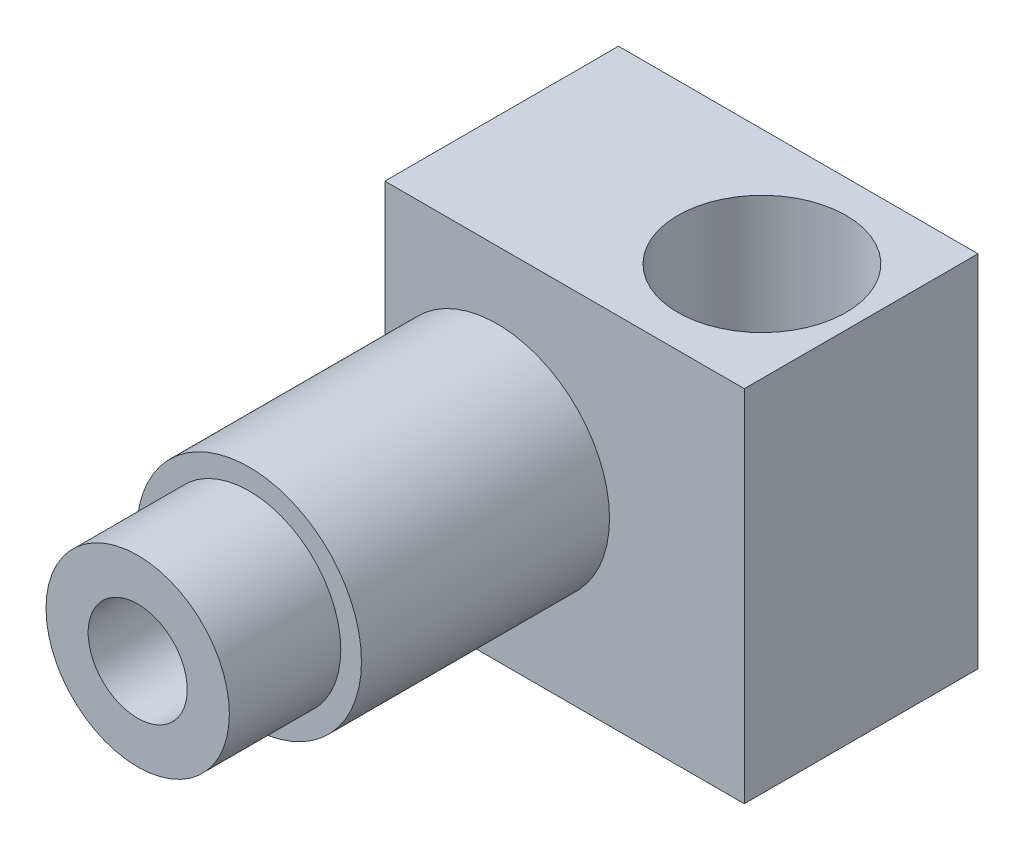
ISO-10303-21;
HEADER;
FILE_DESCRIPTION(('STEP AP214'),'2;1');
FILE_NAME('part.step','',(''),(''),'','','');
FILE_SCHEMA(('AUTOMOTIVE_DESIGN { 1 0 10303 214 1 1 1 1 }'));
ENDSEC;
DATA;
#1=APPLICATION_CONTEXT('core data for automotive mechanical design processes');
#2=APPLICATION_PROTOCOL_DEFINITION('international standard','automotive_design',2000,#1);
#3=PRODUCT_CONTEXT('',#1,'mechanical');
#4=PRODUCT('Part','Part','',(#3));
#5=PRODUCT_RELATED_PRODUCT_CATEGORY('part','',(#4));
#6=PRODUCT_DEFINITION_FORMATION('','',#4);
#7=PRODUCT_DEFINITION_CONTEXT('part definition',#1,'design');
#8=PRODUCT_DEFINITION('design','',#6,#7);
#9=PRODUCT_DEFINITION_SHAPE('','',#8);
#10=(LENGTH_UNIT() NAMED_UNIT(*) SI_UNIT(.MILLI.,.METRE.));
#11=(NAMED_UNIT(*) PLANE_ANGLE_UNIT() SI_UNIT($,.RADIAN.));
#12=(NAMED_UNIT(*) SI_UNIT($,.STERADIAN.) SOLID_ANGLE_UNIT());
#13=UNCERTAINTY_MEASURE_WITH_UNIT(LENGTH_MEASURE(1.E-05),#10,'distance_accuracy_value','');
#14=(GEOMETRIC_REPRESENTATION_CONTEXT(3) GLOBAL_UNCERTAINTY_ASSIGNED_CONTEXT((#13)) GLOBAL_UNIT_ASSIGNED_CONTEXT((#10,
#11,#12)) REPRESENTATION_CONTEXT('',''));
#15=CARTESIAN_POINT('',(0.,0.,0.));
#16=DIRECTION('',(0.,0.,1.));
#17=DIRECTION('',(1.,0.,0.));
#18=AXIS2_PLACEMENT_3D('',#15,#16,#17);
#19=CARTESIAN_POINT('',(-2.38125,0.,16.8275));
#20=DIRECTION('',(0.,0.,-1.));
#21=DIRECTION('',(-1.,0.,0.));
#22=AXIS2_PLACEMENT_3D('',#19,#20,#21);
#23=CYLINDRICAL_SURFACE('',#22,3.96875);
#24=CARTESIAN_POINT('',(-2.38125,0.,4.1275));
#25=DIRECTION('',(0.,0.,1.));
#26=DIRECTION('',(1.,0.,0.));
#27=AXIS2_PLACEMENT_3D('',#24,#25,#26);
#28=CIRCLE('',#27,3.96875);
#29=CARTESIAN_POINT('',(-6.35,0.,4.1275));
#30=VERTEX_POINT('',#29);
#31=EDGE_CURVE('E119',#30,#30,#28,.T.);
#32=ORIENTED_EDGE('',*,*,#31,.T.);
#33=EDGE_LOOP('',(#32));
#34=FACE_BOUND('',#33,.T.);
#35=CARTESIAN_POINT('',(-2.38125,0.,12.8905));
#36=DIRECTION('',(0.,0.,1.));
#37=DIRECTION('',(1.,0.,0.));
#38=AXIS2_PLACEMENT_3D('',#35,#36,#37);
#39=CIRCLE('',#38,3.96875);
#40=CARTESIAN_POINT('',(1.5875,0.,12.8905));
#41=VERTEX_POINT('',#40);
#42=EDGE_CURVE('E116',#41,#41,#39,.T.);
#43=ORIENTED_EDGE('',*,*,#42,.F.);
#44=EDGE_LOOP('',(#43));
#45=FACE_BOUND('',#44,.T.);
#46=ADVANCED_FACE('F34',(#34,#45),#23,.T.);
#47=CARTESIAN_POINT('',(0.,0.,4.1275));
#48=DIRECTION('',(0.,0.,-1.));
#49=DIRECTION('',(-1.,0.,0.));
#50=AXIS2_PLACEMENT_3D('',#47,#48,#49);
#51=PLANE('',#50);
#52=DIRECTION('',(0.,-1.,0.));
#53=VECTOR('',#52,1.);
#54=CARTESIAN_POINT('',(-6.35,-6.34999999999999,4.1275));
#55=LINE('',#54,#53);
#56=CARTESIAN_POINT('',(-6.35,6.35000000000001,4.1275));
#57=VERTEX_POINT('',#56);
#58=EDGE_CURVE('E185',#57,#30,#55,.T.);
#59=ORIENTED_EDGE('',*,*,#58,.T.);
#60=ORIENTED_EDGE('',*,*,#31,.F.);
#61=CARTESIAN_POINT('',(-6.35,-6.34999999999999,4.1275));
#62=VERTEX_POINT('',#61);
#63=EDGE_CURVE('E187',#30,#62,#55,.T.);
#64=ORIENTED_EDGE('',*,*,#63,.T.);
#65=DIRECTION('',(1.,0.,0.));
#66=VECTOR('',#65,1.);
#67=CARTESIAN_POINT('',(-6.35,-6.34999999999999,4.1275));
#68=LINE('',#67,#66);
#69=CARTESIAN_POINT('',(6.35,-6.34999999999999,4.1275));
#70=VERTEX_POINT('',#69);
#71=EDGE_CURVE('E52',#62,#70,#68,.T.);
#72=ORIENTED_EDGE('',*,*,#71,.T.);
#73=DIRECTION('',(0.,1.,0.));
#74=VECTOR('',#73,1.);
#75=CARTESIAN_POINT('',(6.35,-6.34999999999999,4.1275));
#76=LINE('',#75,#74);
#77=CARTESIAN_POINT('',(6.35,6.35000000000001,4.1275));
#78=VERTEX_POINT('',#77);
#79=EDGE_CURVE('E108',#70,#78,#76,.T.);
#80=ORIENTED_EDGE('',*,*,#79,.T.);
#81=DIRECTION('',(-1.,0.,0.));
#82=VECTOR('',#81,1.);
#83=CARTESIAN_POINT('',(-6.35,6.35000000000001,4.1275));
#84=LINE('',#83,#82);
#85=EDGE_CURVE('E84',#78,#57,#84,.T.);
#86=ORIENTED_EDGE('',*,*,#85,.T.);
#87=EDGE_LOOP('',(#59,#60,#64,#72,#80,#86));
#88=FACE_BOUND('',#87,.T.);
#89=ADVANCED_FACE('F141',(#88),#51,.F.);
#90=CARTESIAN_POINT('',(6.35,-6.34999999999999,4.1275));
#91=DIRECTION('',(-1.,0.,0.));
#92=DIRECTION('',(0.,0.,1.));
#93=AXIS2_PLACEMENT_3D('',#90,#91,#92);
#94=PLANE('',#93);
#95=DIRECTION('',(0.,1.,0.));
#96=VECTOR('',#95,1.);
#97=CARTESIAN_POINT('',(6.35,-6.34999999999999,-4.1275));
#98=LINE('',#97,#96);
#99=CARTESIAN_POINT('',(6.35,-6.34999999999999,-4.1275));
#100=VERTEX_POINT('',#99);
#101=CARTESIAN_POINT('',(6.35,6.35000000000001,-4.1275));
#102=VERTEX_POINT('',#101);
#103=EDGE_CURVE('E103',#100,#102,#98,.T.);
#104=ORIENTED_EDGE('',*,*,#103,.T.);
#105=DIRECTION('',(0.,0.,-1.));
#106=VECTOR('',#105,1.);
#107=CARTESIAN_POINT('',(6.35,6.35000000000001,4.1275));
#108=LINE('',#107,#106);
#109=EDGE_CURVE('E114',#78,#102,#108,.T.);
#110=ORIENTED_EDGE('',*,*,#109,.F.);
#111=ORIENTED_EDGE('',*,*,#79,.F.);
#112=DIRECTION('',(0.,0.,-1.));
#113=VECTOR('',#112,1.);
#114=CARTESIAN_POINT('',(6.35,-6.34999999999999,4.1275));
#115=LINE('',#114,#113);
#116=EDGE_CURVE('E109',#70,#100,#115,.T.);
#117=ORIENTED_EDGE('',*,*,#116,.T.);
#118=EDGE_LOOP('',(#104,#110,#111,#117));
#119=FACE_BOUND('',#118,.T.);
#120=ADVANCED_FACE('F147',(#119),#94,.F.);
#121=CARTESIAN_POINT('',(-6.35,6.35000000000001,4.1275));
#122=DIRECTION('',(0.,-1.,0.));
#123=DIRECTION('',(0.,0.,-1.));
#124=AXIS2_PLACEMENT_3D('',#121,#122,#123);
#125=PLANE('',#124);
#126=CARTESIAN_POINT('',(2.8448,6.35000000000001,0.));
#127=DIRECTION('',(0.,-1.,0.));
#128=DIRECTION('',(0.,0.,-1.));
#129=AXIS2_PLACEMENT_3D('',#126,#127,#128);
#130=CIRCLE('',#129,2.9718);
#131=CARTESIAN_POINT('',(2.8448,6.35000000000001,-2.9718));
#132=VERTEX_POINT('',#131);
#133=EDGE_CURVE('E179',#132,#132,#130,.T.);
#134=ORIENTED_EDGE('',*,*,#133,.T.);
#135=EDGE_LOOP('',(#134));
#136=FACE_BOUND('',#135,.T.);
#137=DIRECTION('',(-1.,0.,0.));
#138=VECTOR('',#137,1.);
#139=CARTESIAN_POINT('',(-6.35,6.35000000000001,-4.1275));
#140=LINE('',#139,#138);
#141=CARTESIAN_POINT('',(-6.35,6.35000000000001,-4.1275));
#142=VERTEX_POINT('',#141);
#143=EDGE_CURVE('E102',#102,#142,#140,.T.);
#144=ORIENTED_EDGE('',*,*,#143,.T.);
#145=DIRECTION('',(0.,0.,-1.));
#146=VECTOR('',#145,1.);
#147=CARTESIAN_POINT('',(-6.35,6.35000000000001,4.1275));
#148=LINE('',#147,#146);
#149=EDGE_CURVE('E94',#57,#142,#148,.T.);
#150=ORIENTED_EDGE('',*,*,#149,.F.);
#151=ORIENTED_EDGE('',*,*,#85,.F.);
#152=ORIENTED_EDGE('',*,*,#109,.T.);
#153=EDGE_LOOP('',(#144,#150,#151,#152));
#154=FACE_BOUND('',#153,.T.);
#155=ADVANCED_FACE('F168',(#136,#154),#125,.F.);
#156=CARTESIAN_POINT('',(-6.35,-6.34999999999999,4.1275));
#157=DIRECTION('',(1.,0.,0.));
#158=DIRECTION('',(0.,0.,-1.));
#159=AXIS2_PLACEMENT_3D('',#156,#157,#158);
#160=PLANE('',#159);
#161=CARTESIAN_POINT('',(-6.35,4.35000000000001,-0.8725));
#162=DIRECTION('',(-1.,0.,0.));
#163=DIRECTION('',(0.,0.,1.));
#164=AXIS2_PLACEMENT_3D('',#161,#162,#163);
#165=CIRCLE('',#164,1.143);
#166=CARTESIAN_POINT('',(-6.35,4.35000000000001,0.2705));
#167=VERTEX_POINT('',#166);
#168=EDGE_CURVE('E209',#167,#167,#165,.T.);
#169=ORIENTED_EDGE('',*,*,#168,.F.);
#170=EDGE_LOOP('',(#169));
#171=FACE_BOUND('',#170,.T.);
#172=DIRECTION('',(0.,-1.,0.));
#173=VECTOR('',#172,1.);
#174=CARTESIAN_POINT('',(-6.35,-6.34999999999999,-4.1275));
#175=LINE('',#174,#173);
#176=CARTESIAN_POINT('',(-6.35,0.,-4.1275));
#177=VERTEX_POINT('',#176);
#178=EDGE_CURVE('E91',#142,#177,#175,.T.);
#179=ORIENTED_EDGE('',*,*,#178,.T.);
#180=CARTESIAN_POINT('',(-6.35,-6.34999999999999,-4.1275));
#181=VERTEX_POINT('',#180);
#182=EDGE_CURVE('E70',#177,#181,#175,.T.);
#183=ORIENTED_EDGE('',*,*,#182,.T.);
#184=DIRECTION('',(0.,0.,-1.));
#185=VECTOR('',#184,1.);
#186=CARTESIAN_POINT('',(-6.35,-6.34999999999999,4.1275));
#187=LINE('',#186,#185);
#188=EDGE_CURVE('E111',#62,#181,#187,.T.);
#189=ORIENTED_EDGE('',*,*,#188,.F.);
#190=ORIENTED_EDGE('',*,*,#63,.F.);
#191=ORIENTED_EDGE('',*,*,#58,.F.);
#192=ORIENTED_EDGE('',*,*,#149,.T.);
#193=EDGE_LOOP('',(#179,#183,#189,#190,#191,#192));
#194=FACE_BOUND('',#193,.T.);
#195=ADVANCED_FACE('F92',(#171,#194),#160,.F.);
#196=CARTESIAN_POINT('',(-6.35,-6.34999999999999,4.1275));
#197=DIRECTION('',(0.,1.,0.));
#198=DIRECTION('',(0.,0.,1.));
#199=AXIS2_PLACEMENT_3D('',#196,#197,#198);
#200=PLANE('',#199);
#201=CARTESIAN_POINT('',(2.8448,-6.34999999999999,0.));
#202=DIRECTION('',(0.,-1.,0.));
#203=DIRECTION('',(0.,0.,-1.));
#204=AXIS2_PLACEMENT_3D('',#201,#202,#203);
#205=CIRCLE('',#204,2.9718);
#206=CARTESIAN_POINT('',(2.8448,-6.34999999999999,-2.9718));
#207=VERTEX_POINT('',#206);
#208=EDGE_CURVE('E181',#207,#207,#205,.T.);
#209=ORIENTED_EDGE('',*,*,#208,.F.);
#210=EDGE_LOOP('',(#209));
#211=FACE_BOUND('',#210,.T.);
#212=DIRECTION('',(1.,0.,0.));
#213=VECTOR('',#212,1.);
#214=CARTESIAN_POINT('',(-6.35,-6.34999999999999,-4.1275));
#215=LINE('',#214,#213);
#216=EDGE_CURVE('E76',#181,#100,#215,.T.);
#217=ORIENTED_EDGE('',*,*,#216,.T.);
#218=ORIENTED_EDGE('',*,*,#116,.F.);
#219=ORIENTED_EDGE('',*,*,#71,.F.);
#220=ORIENTED_EDGE('',*,*,#188,.T.);
#221=EDGE_LOOP('',(#217,#218,#219,#220));
#222=FACE_BOUND('',#221,.T.);
#223=ADVANCED_FACE('F162',(#211,#222),#200,.F.);
#224=CARTESIAN_POINT('',(0.,0.,-4.1275));
#225=DIRECTION('',(0.,0.,-1.));
#226=DIRECTION('',(-1.,0.,0.));
#227=AXIS2_PLACEMENT_3D('',#224,#225,#226);
#228=PLANE('',#227);
#229=ORIENTED_EDGE('',*,*,#182,.F.);
#230=CARTESIAN_POINT('',(-2.38125,0.,-4.1275));
#231=DIRECTION('',(0.,0.,-1.));
#232=DIRECTION('',(-1.,0.,0.));
#233=AXIS2_PLACEMENT_3D('',#230,#231,#232);
#234=CIRCLE('',#233,3.96875);
#235=EDGE_CURVE('E100',#177,#177,#234,.T.);
#236=ORIENTED_EDGE('',*,*,#235,.F.);
#237=ORIENTED_EDGE('',*,*,#178,.F.);
#238=ORIENTED_EDGE('',*,*,#143,.F.);
#239=ORIENTED_EDGE('',*,*,#103,.F.);
#240=ORIENTED_EDGE('',*,*,#216,.F.);
#241=EDGE_LOOP('',(#229,#236,#237,#238,#239,#240));
#242=FACE_BOUND('',#241,.T.);
#243=ADVANCED_FACE('F98',(#242),#228,.T.);
#244=CARTESIAN_POINT('',(2.8448,6.35000000000001,0.));
#245=DIRECTION('',(0.,-1.,0.));
#246=DIRECTION('',(0.,0.,-1.));
#247=AXIS2_PLACEMENT_3D('',#244,#245,#246);
#248=CYLINDRICAL_SURFACE('',#247,2.9718);
#249=ORIENTED_EDGE('',*,*,#133,.F.);
#250=EDGE_LOOP('',(#249));
#251=FACE_BOUND('',#250,.T.);
#252=ORIENTED_EDGE('',*,*,#208,.T.);
#253=EDGE_LOOP('',(#252));
#254=FACE_BOUND('',#253,.T.);
#255=ADVANCED_FACE('F155',(#251,#254),#248,.F.);
#256=CARTESIAN_POINT('',(0.,0.,12.8905));
#257=DIRECTION('',(0.,0.,1.));
#258=DIRECTION('',(1.,0.,0.));
#259=AXIS2_PLACEMENT_3D('',#256,#257,#258);
#260=PLANE('',#259);
#261=CARTESIAN_POINT('',(-2.38125,0.,12.8905));
#262=DIRECTION('',(0.,0.,1.));
#263=DIRECTION('',(1.,0.,0.));
#264=AXIS2_PLACEMENT_3D('',#261,#262,#263);
#265=CIRCLE('',#264,3.2385);
#266=CARTESIAN_POINT('',(0.857250000000002,0.,12.8905));
#267=VERTEX_POINT('',#266);
#268=EDGE_CURVE('E120',#267,#267,#265,.T.);
#269=ORIENTED_EDGE('',*,*,#268,.F.);
#270=EDGE_LOOP('',(#269));
#271=FACE_BOUND('',#270,.T.);
#272=ORIENTED_EDGE('',*,*,#42,.T.);
#273=EDGE_LOOP('',(#272));
#274=FACE_BOUND('',#273,.T.);
#275=ADVANCED_FACE('F157',(#271,#274),#260,.T.);
#276=CARTESIAN_POINT('',(-2.38125,0.,12.8905));
#277=DIRECTION('',(0.,0.,1.));
#278=DIRECTION('',(1.,0.,0.));
#279=AXIS2_PLACEMENT_3D('',#276,#277,#278);
#280=CYLINDRICAL_SURFACE('',#279,3.2385);
#281=ORIENTED_EDGE('',*,*,#268,.T.);
#282=EDGE_LOOP('',(#281));
#283=FACE_BOUND('',#282,.T.);
#284=CARTESIAN_POINT('',(-2.38125,0.,16.8275));
#285=DIRECTION('',(0.,0.,1.));
#286=DIRECTION('',(1.,0.,0.));
#287=AXIS2_PLACEMENT_3D('',#284,#285,#286);
#288=CIRCLE('',#287,3.2385);
#289=CARTESIAN_POINT('',(0.857250000000002,0.,16.8275));
#290=VERTEX_POINT('',#289);
#291=EDGE_CURVE('E193',#290,#290,#288,.T.);
#292=ORIENTED_EDGE('',*,*,#291,.F.);
#293=EDGE_LOOP('',(#292));
#294=FACE_BOUND('',#293,.T.);
#295=ADVANCED_FACE('F237',(#283,#294),#280,.T.);
#296=CARTESIAN_POINT('',(-2.38125,0.,16.8275));
#297=DIRECTION('',(0.,0.,1.));
#298=DIRECTION('',(1.,0.,0.));
#299=AXIS2_PLACEMENT_3D('',#296,#297,#298);
#300=PLANE('',#299);
#301=CARTESIAN_POINT('',(-2.38125,0.,16.8275));
#302=DIRECTION('',(0.,0.,1.));
#303=DIRECTION('',(1.,0.,0.));
#304=AXIS2_PLACEMENT_3D('',#301,#302,#303);
#305=CIRCLE('',#304,1.75);
#306=CARTESIAN_POINT('',(-0.631249999999998,0.,16.8275));
#307=VERTEX_POINT('',#306);
#308=EDGE_CURVE('E205',#307,#307,#305,.T.);
#309=ORIENTED_EDGE('',*,*,#308,.F.);
#310=EDGE_LOOP('',(#309));
#311=FACE_BOUND('',#310,.T.);
#312=ORIENTED_EDGE('',*,*,#291,.T.);
#313=EDGE_LOOP('',(#312));
#314=FACE_BOUND('',#313,.T.);
#315=ADVANCED_FACE('F153',(#311,#314),#300,.T.);
#316=CARTESIAN_POINT('',(-2.38125,0.,-7.1755));
#317=DIRECTION('',(0.,0.,1.));
#318=DIRECTION('',(1.,0.,0.));
#319=AXIS2_PLACEMENT_3D('',#316,#317,#318);
#320=CYLINDRICAL_SURFACE('',#319,3.96875);
#321=CARTESIAN_POINT('',(-2.38125,0.,-5.4255));
#322=DIRECTION('',(0.,0.,-1.));
#323=DIRECTION('',(-1.,0.,0.));
#324=AXIS2_PLACEMENT_3D('',#321,#322,#323);
#325=CIRCLE('',#324,3.96875);
#326=CARTESIAN_POINT('',(1.5875,0.,-5.4255));
#327=VERTEX_POINT('',#326);
#328=EDGE_CURVE('E12',#327,#327,#325,.F.);
#329=ORIENTED_EDGE('',*,*,#328,.T.);
#330=EDGE_LOOP('',(#329));
#331=FACE_BOUND('',#330,.T.);
#332=ORIENTED_EDGE('',*,*,#235,.T.);
#333=EDGE_LOOP('',(#332));
#334=FACE_BOUND('',#333,.T.);
#335=ADVANCED_FACE('F136',(#331,#334),#320,.T.);
#336=CARTESIAN_POINT('',(-2.38125,0.,-7.1755));
#337=DIRECTION('',(0.,0.,-1.));
#338=DIRECTION('',(-1.,0.,0.));
#339=AXIS2_PLACEMENT_3D('',#336,#337,#338);
#340=PLANE('',#339);
#341=CARTESIAN_POINT('',(-2.38125,0.,-7.1755));
#342=DIRECTION('',(0.,0.,-1.));
#343=DIRECTION('',(-1.,0.,0.));
#344=AXIS2_PLACEMENT_3D('',#341,#342,#343);
#345=CIRCLE('',#344,0.175);
#346=CARTESIAN_POINT('',(-2.55625,0.,-7.1755));
#347=VERTEX_POINT('',#346);
#348=EDGE_CURVE('E199',#347,#347,#345,.T.);
#349=ORIENTED_EDGE('',*,*,#348,.F.);
#350=EDGE_LOOP('',(#349));
#351=FACE_BOUND('',#350,.T.);
#352=CARTESIAN_POINT('',(-2.38125,0.,-7.1755));
#353=DIRECTION('',(0.,0.,-1.));
#354=DIRECTION('',(-1.,0.,0.));
#355=AXIS2_PLACEMENT_3D('',#352,#353,#354);
#356=CIRCLE('',#355,0.937661086754477);
#357=CARTESIAN_POINT('',(-1.44358891324552,0.,-7.1755));
#358=VERTEX_POINT('',#357);
#359=EDGE_CURVE('E44',#358,#358,#356,.T.);
#360=ORIENTED_EDGE('',*,*,#359,.T.);
#361=EDGE_LOOP('',(#360));
#362=FACE_BOUND('',#361,.T.);
#363=ADVANCED_FACE('F124',(#351,#362),#340,.T.);
#364=CARTESIAN_POINT('',(-2.38125,0.,-7.1755));
#365=DIRECTION('',(0.,0.,1.));
#366=DIRECTION('',(1.,0.,0.));
#367=AXIS2_PLACEMENT_3D('',#364,#365,#366);
#368=CONICAL_SURFACE('',#367,0.937661086754477,1.0471975511966);
#369=CARTESIAN_POINT('',(1.5875,0.,-5.4255));
#370=CARTESIAN_POINT('',(1.5559261571537,0.,-5.44372916666667));
#371=CARTESIAN_POINT('',(1.52435231430739,0.,-5.46195833333333));
#372=CARTESIAN_POINT('',(1.46120462861477,0.,-5.49841666666667));
#373=CARTESIAN_POINT('',(1.42963078576847,0.,-5.51664583333333));
#374=CARTESIAN_POINT('',(1.36648310007585,0.,-5.55310416666667));
#375=CARTESIAN_POINT('',(1.33490925722954,0.,-5.57133333333333));
#376=CARTESIAN_POINT('',(1.27176157153693,0.,-5.60779166666667));
#377=CARTESIAN_POINT('',(1.24018772869062,0.,-5.62602083333333));
#378=CARTESIAN_POINT('',(1.17704004299801,0.,-5.66247916666667));
#379=CARTESIAN_POINT('',(1.1454662001517,0.,-5.68070833333333));
#380=CARTESIAN_POINT('',(1.08231851445908,0.,-5.71716666666667));
#381=CARTESIAN_POINT('',(1.05074467161278,0.,-5.73539583333333));
#382=CARTESIAN_POINT('',(0.987596985920161,0.,-5.77185416666667));
#383=CARTESIAN_POINT('',(0.956023143073853,0.,-5.79008333333333));
#384=CARTESIAN_POINT('',(0.892875457381238,0.,-5.82654166666667));
#385=CARTESIAN_POINT('',(0.86130161453493,0.,-5.84477083333333));
#386=CARTESIAN_POINT('',(0.798153928842315,0.,-5.88122916666667));
#387=CARTESIAN_POINT('',(0.766580085996008,0.,-5.89945833333333));
#388=CARTESIAN_POINT('',(0.703432400303393,0.,-5.93591666666667));
#389=CARTESIAN_POINT('',(0.671858557457085,0.,-5.95414583333333));
#390=CARTESIAN_POINT('',(0.60871087176447,0.,-5.99060416666667));
#391=CARTESIAN_POINT('',(0.577137028918162,0.,-6.00883333333333));
#392=CARTESIAN_POINT('',(0.513989343225547,0.,-6.04529166666667));
#393=CARTESIAN_POINT('',(0.48241550037924,0.,-6.06352083333333));
#394=CARTESIAN_POINT('',(0.419267814686625,0.,-6.09997916666667));
#395=CARTESIAN_POINT('',(0.387693971840317,0.,-6.11820833333333));
#396=CARTESIAN_POINT('',(0.324546286147702,0.,-6.15466666666667));
#397=CARTESIAN_POINT('',(0.292972443301395,0.,-6.17289583333333));
#398=CARTESIAN_POINT('',(0.22982475760878,0.,-6.20935416666667));
#399=CARTESIAN_POINT('',(0.198250914762472,0.,-6.22758333333333));
#400=CARTESIAN_POINT('',(0.135103229069857,0.,-6.26404166666666));
#401=CARTESIAN_POINT('',(0.103529386223549,0.,-6.28227083333333));
#402=CARTESIAN_POINT('',(0.0403817005309344,0.,-6.31872916666667));
#403=CARTESIAN_POINT('',(0.00880785768462691,0.,-6.33695833333333));
#404=CARTESIAN_POINT('',(-0.0543398280079883,0.,-6.37341666666667));
#405=CARTESIAN_POINT('',(-0.085913670854296,0.,-6.39164583333333));
#406=CARTESIAN_POINT('',(-0.149061356546911,0.,-6.42810416666667));
#407=CARTESIAN_POINT('',(-0.180635199393218,0.,-6.44633333333333));
#408=CARTESIAN_POINT('',(-0.243782885085833,0.,-6.48279166666667));
#409=CARTESIAN_POINT('',(-0.275356727932141,0.,-6.50102083333333));
#410=CARTESIAN_POINT('',(-0.338504413624756,0.,-6.53747916666667));
#411=CARTESIAN_POINT('',(-0.370078256471064,0.,-6.55570833333333));
#412=CARTESIAN_POINT('',(-0.433225942163679,0.,-6.59216666666667));
#413=CARTESIAN_POINT('',(-0.464799785009986,0.,-6.61039583333333));
#414=CARTESIAN_POINT('',(-0.527947470702601,0.,-6.64685416666667));
#415=CARTESIAN_POINT('',(-0.559521313548909,0.,-6.66508333333333));
#416=CARTESIAN_POINT('',(-0.622668999241524,0.,-6.70154166666667));
#417=CARTESIAN_POINT('',(-0.654242842087832,0.,-6.71977083333333));
#418=CARTESIAN_POINT('',(-0.717390527780447,0.,-6.75622916666667));
#419=CARTESIAN_POINT('',(-0.748964370626754,0.,-6.77445833333333));
#420=CARTESIAN_POINT('',(-0.812112056319369,0.,-6.81091666666667));
#421=CARTESIAN_POINT('',(-0.843685899165677,0.,-6.82914583333333));
#422=CARTESIAN_POINT('',(-0.906833584858292,0.,-6.86560416666667));
#423=CARTESIAN_POINT('',(-0.938407427704599,0.,-6.88383333333333));
#424=CARTESIAN_POINT('',(-1.00155511339721,0.,-6.92029166666667));
#425=CARTESIAN_POINT('',(-1.03312895624352,0.,-6.93852083333333));
#426=CARTESIAN_POINT('',(-1.09627664193614,0.,-6.97497916666667));
#427=CARTESIAN_POINT('',(-1.12785048478244,0.,-6.99320833333333));
#428=CARTESIAN_POINT('',(-1.19099817047506,0.,-7.02966666666667));
#429=CARTESIAN_POINT('',(-1.22257201332137,0.,-7.04789583333333));
#430=CARTESIAN_POINT('',(-1.28571969901398,0.,-7.08435416666667));
#431=CARTESIAN_POINT('',(-1.31729354186029,0.,-7.10258333333333));
#432=CARTESIAN_POINT('',(-1.3804412275529,0.,-7.13904166666667));
#433=CARTESIAN_POINT('',(-1.41201507039921,0.,-7.15727083333333));
#434=CARTESIAN_POINT('',(-1.44358891324552,0.,-7.1755));
#435=B_SPLINE_CURVE_WITH_KNOTS('',3,(#369,#370,#371,#372,#373,#374,#375,#376,#377,#378,#379,
#380,#381,#382,#383,#384,#385,#386,#387,#388,#389,#390,#391,#392,#393,#394,#395,#396,#397,#398,
#399,#400,#401,#402,#403,#404,#405,#406,#407,#408,#409,#410,#411,#412,#413,#414,#415,#416,#417,
#418,#419,#420,#421,#422,#423,#424,#425,#426,#427,#428,#429,#430,#431,#432,#433,#434),
.UNSPECIFIED.,.F.,.F.,(4,2,2,2,2,2,2,2,2,2,2,2,2,2,2,2,2,2,2,2,2,2,2,2,2,2,2,2,2,2,2,2,4),(0.,
0.109375,0.21875,0.328124999999999,0.437499999999999,0.546874999999999,0.656249999999998,
0.765624999999998,0.874999999999998,0.984374999999997,1.09375,1.203125,1.3125,1.421875,1.53125,
1.640625,1.75,1.85937499999999,1.96874999999999,2.07812499999999,2.18749999999999,
2.29687499999999,2.40624999999999,2.51562499999999,2.62499999999999,2.73437499999999,
2.84374999999999,2.95312499999999,3.06249999999999,3.17187499999999,3.28124999999999,
3.39062499999999,3.49999999999999),.UNSPECIFIED.);
#436=EDGE_CURVE('BSEAM36',#327,#358,#435,.T.);
#437=ORIENTED_EDGE('',*,*,#328,.F.);
#438=ORIENTED_EDGE('',*,*,#359,.F.);
#439=ORIENTED_EDGE('',*,*,#436,.T.);
#440=ORIENTED_EDGE('',*,*,#436,.F.);
#441=EDGE_LOOP('',(#437,#439,#438,#440));
#442=FACE_BOUND('',#441,.T.);
#443=ADVANCED_FACE('F36',(#442),#368,.T.);
#444=CARTESIAN_POINT('',(-2.38125,0.,16.8275));
#445=DIRECTION('',(0.,0.,-1.));
#446=DIRECTION('',(-1.,0.,0.));
#447=AXIS2_PLACEMENT_3D('',#444,#445,#446);
#448=CYLINDRICAL_SURFACE('',#447,0.175);
#449=CARTESIAN_POINT('',(-2.38125,0.,-5.11885547496842));
#450=DIRECTION('',(0.,0.,1.));
#451=DIRECTION('',(1.,0.,0.));
#452=AXIS2_PLACEMENT_3D('',#449,#450,#451);
#453=CIRCLE('',#452,0.175);
#454=CARTESIAN_POINT('',(-2.20625,0.,-5.11885547496842));
#455=VERTEX_POINT('',#454);
#456=EDGE_CURVE('E38',#455,#455,#453,.T.);
#457=ORIENTED_EDGE('',*,*,#456,.T.);
#458=EDGE_LOOP('',(#457));
#459=FACE_BOUND('',#458,.T.);
#460=ORIENTED_EDGE('',*,*,#348,.T.);
#461=EDGE_LOOP('',(#460));
#462=FACE_BOUND('',#461,.T.);
#463=ADVANCED_FACE('F127',(#459,#462),#448,.F.);
#464=CARTESIAN_POINT('',(-2.38125,0.,-4.1725));
#465=DIRECTION('',(0.,0.,1.));
#466=DIRECTION('',(1.,0.,0.));
#467=AXIS2_PLACEMENT_3D('',#464,#465,#466);
#468=CONICAL_SURFACE('',#467,1.75,1.02974425867665);
#469=CARTESIAN_POINT('',(-2.38125,0.,-4.1725));
#470=DIRECTION('',(0.,0.,1.));
#471=DIRECTION('',(1.,0.,0.));
#472=AXIS2_PLACEMENT_3D('',#469,#470,#471);
#473=CIRCLE('',#472,1.75);
#474=CARTESIAN_POINT('',(-0.631250000000002,0.,-4.1725));
#475=VERTEX_POINT('',#474);
#476=EDGE_CURVE('E202',#475,#475,#473,.T.);
#477=CARTESIAN_POINT('',(-0.631250000000002,0.,-4.1725));
#478=CARTESIAN_POINT('',(-0.647656250000002,0.,-4.18235786953092));
#479=CARTESIAN_POINT('',(-0.664062500000002,0.,-4.19221573906185));
#480=CARTESIAN_POINT('',(-0.696875000000002,0.,-4.21193147812369));
#481=CARTESIAN_POINT('',(-0.713281250000002,0.,-4.22178934765461));
#482=CARTESIAN_POINT('',(-0.746093750000002,0.,-4.24150508671645));
#483=CARTESIAN_POINT('',(-0.762500000000002,0.,-4.25136295624737));
#484=CARTESIAN_POINT('',(-0.795312500000001,0.,-4.27107869530921));
#485=CARTESIAN_POINT('',(-0.811718750000001,0.,-4.28093656484013));
#486=CARTESIAN_POINT('',(-0.844531250000001,0.,-4.30065230390198));
#487=CARTESIAN_POINT('',(-0.860937500000001,0.,-4.3105101734329));
#488=CARTESIAN_POINT('',(-0.893750000000001,0.,-4.33022591249474));
#489=CARTESIAN_POINT('',(-0.910156250000001,0.,-4.34008378202566));
#490=CARTESIAN_POINT('',(-0.942968750000001,0.,-4.3597995210875));
#491=CARTESIAN_POINT('',(-0.959375000000001,0.,-4.36965739061842));
#492=CARTESIAN_POINT('',(-0.992187500000001,0.,-4.38937312968026));
#493=CARTESIAN_POINT('',(-1.00859375,0.,-4.39923099921119));
#494=CARTESIAN_POINT('',(-1.04140625,0.,-4.41894673827303));
#495=CARTESIAN_POINT('',(-1.0578125,0.,-4.42880460780395));
#496=CARTESIAN_POINT('',(-1.090625,0.,-4.44852034686579));
#497=CARTESIAN_POINT('',(-1.10703125,0.,-4.45837821639671));
#498=CARTESIAN_POINT('',(-1.13984375,0.,-4.47809395545855));
#499=CARTESIAN_POINT('',(-1.15625,0.,-4.48795182498947));
#500=CARTESIAN_POINT('',(-1.1890625,0.,-4.50766756405132));
#501=CARTESIAN_POINT('',(-1.20546875,0.,-4.51752543358224));
#502=CARTESIAN_POINT('',(-1.23828125,0.,-4.53724117264408));
#503=CARTESIAN_POINT('',(-1.2546875,0.,-4.547099042175));
#504=CARTESIAN_POINT('',(-1.2875,0.,-4.56681478123684));
#505=CARTESIAN_POINT('',(-1.30390625,0.,-4.57667265076776));
#506=CARTESIAN_POINT('',(-1.33671875,0.,-4.5963883898296));
#507=CARTESIAN_POINT('',(-1.353125,0.,-4.60624625936052));
#508=CARTESIAN_POINT('',(-1.3859375,0.,-4.62596199842237));
#509=CARTESIAN_POINT('',(-1.40234375,0.,-4.63581986795329));
#510=CARTESIAN_POINT('',(-1.43515625,0.,-4.65553560701513));
#511=CARTESIAN_POINT('',(-1.4515625,0.,-4.66539347654605));
#512=CARTESIAN_POINT('',(-1.484375,0.,-4.68510921560789));
#513=CARTESIAN_POINT('',(-1.50078125,0.,-4.69496708513882));
#514=CARTESIAN_POINT('',(-1.53359375,0.,-4.71468282420066));
#515=CARTESIAN_POINT('',(-1.55,0.,-4.72454069373158));
#516=CARTESIAN_POINT('',(-1.5828125,0.,-4.74425643279342));
#517=CARTESIAN_POINT('',(-1.59921875,0.,-4.75411430232434));
#518=CARTESIAN_POINT('',(-1.63203125,0.,-4.77383004138618));
#519=CARTESIAN_POINT('',(-1.6484375,0.,-4.7836879109171));
#520=CARTESIAN_POINT('',(-1.68125,0.,-4.80340364997894));
#521=CARTESIAN_POINT('',(-1.69765625,0.,-4.81326151950987));
#522=CARTESIAN_POINT('',(-1.73046875,0.,-4.83297725857171));
#523=CARTESIAN_POINT('',(-1.746875,0.,-4.84283512810263));
#524=CARTESIAN_POINT('',(-1.7796875,0.,-4.86255086716447));
#525=CARTESIAN_POINT('',(-1.79609375,0.,-4.87240873669539));
#526=CARTESIAN_POINT('',(-1.82890625,0.,-4.89212447575723));
#527=CARTESIAN_POINT('',(-1.8453125,0.,-4.90198234528815));
#528=CARTESIAN_POINT('',(-1.878125,0.,-4.92169808435));
#529=CARTESIAN_POINT('',(-1.89453125,0.,-4.93155595388092));
#530=CARTESIAN_POINT('',(-1.92734375,0.,-4.95127169294276));
#531=CARTESIAN_POINT('',(-1.94375,0.,-4.96112956247368));
#532=CARTESIAN_POINT('',(-1.9765625,0.,-4.98084530153552));
#533=CARTESIAN_POINT('',(-1.99296875,0.,-4.99070317106644));
#534=CARTESIAN_POINT('',(-2.02578125,0.,-5.01041891012829));
#535=CARTESIAN_POINT('',(-2.0421875,0.,-5.02027677965921));
#536=CARTESIAN_POINT('',(-2.075,0.,-5.03999251872105));
#537=CARTESIAN_POINT('',(-2.09140625,0.,-5.04985038825197));
#538=CARTESIAN_POINT('',(-2.12421875,0.,-5.06956612731381));
#539=CARTESIAN_POINT('',(-2.140625,0.,-5.07942399684473));
#540=CARTESIAN_POINT('',(-2.1734375,0.,-5.09913973590657));
#541=CARTESIAN_POINT('',(-2.18984375,0.,-5.1089976054375));
#542=CARTESIAN_POINT('',(-2.20625,0.,-5.11885547496842));
#543=B_SPLINE_CURVE_WITH_KNOTS('',3,(#477,#478,#479,#480,#481,#482,#483,#484,#485,#486,#487,
#488,#489,#490,#491,#492,#493,#494,#495,#496,#497,#498,#499,#500,#501,#502,#503,#504,#505,#506,
#507,#508,#509,#510,#511,#512,#513,#514,#515,#516,#517,#518,#519,#520,#521,#522,#523,#524,#525,
#526,#527,#528,#529,#530,#531,#532,#533,#534,#535,#536,#537,#538,#539,#540,#541,#542),
.UNSPECIFIED.,.F.,.F.,(4,2,2,2,2,2,2,2,2,2,2,2,2,2,2,2,2,2,2,2,2,2,2,2,2,2,2,2,2,2,2,2,4),(0.,
0.057420237519192,0.114840475038384,0.172260712557576,0.229680950076768,0.28710118759596,
0.344521425115152,0.401941662634344,0.459361900153536,0.516782137672728,0.57420237519192,
0.631622612711113,0.689042850230305,0.746463087749497,0.803883325268688,0.861303562787881,
0.918723800307073,0.976144037826265,1.03356427534546,1.09098451286465,1.14840475038384,
1.20582498790303,1.26324522542223,1.32066546294142,1.37808570046061,1.4355059379798,
1.49292617549899,1.55034641301819,1.60776665053738,1.66518688805657,1.72260712557576,
1.78002736309495,1.83744760061415),.UNSPECIFIED.);
#544=EDGE_CURVE('BSEAM133',#475,#455,#543,.T.);
#545=ORIENTED_EDGE('',*,*,#476,.T.);
#546=ORIENTED_EDGE('',*,*,#456,.F.);
#547=ORIENTED_EDGE('',*,*,#544,.T.);
#548=ORIENTED_EDGE('',*,*,#544,.F.);
#549=EDGE_LOOP('',(#545,#547,#546,#548));
#550=FACE_BOUND('',#549,.T.);
#551=ADVANCED_FACE('F133',(#550),#468,.F.);
#552=CARTESIAN_POINT('',(-2.38125,0.,16.8275));
#553=DIRECTION('',(0.,0.,1.));
#554=DIRECTION('',(1.,0.,0.));
#555=AXIS2_PLACEMENT_3D('',#552,#553,#554);
#556=CYLINDRICAL_SURFACE('',#555,1.75);
#557=ORIENTED_EDGE('',*,*,#476,.F.);
#558=EDGE_LOOP('',(#557));
#559=FACE_BOUND('',#558,.T.);
#560=ORIENTED_EDGE('',*,*,#308,.T.);
#561=EDGE_LOOP('',(#560));
#562=FACE_BOUND('',#561,.T.);
#563=ADVANCED_FACE('F220',(#559,#562),#556,.F.);
#564=CARTESIAN_POINT('',(-2.35,4.35000000000001,-0.8725));
#565=DIRECTION('',(-1.,0.,0.));
#566=DIRECTION('',(0.,0.,1.));
#567=AXIS2_PLACEMENT_3D('',#564,#565,#566);
#568=CYLINDRICAL_SURFACE('',#567,1.143);
#569=CARTESIAN_POINT('',(-2.35,4.35000000000001,-0.8725));
#570=DIRECTION('',(-1.,0.,0.));
#571=DIRECTION('',(0.,0.,1.));
#572=AXIS2_PLACEMENT_3D('',#569,#570,#571);
#573=CIRCLE('',#572,1.143);
#574=CARTESIAN_POINT('',(-2.35,4.35000000000001,0.2705));
#575=VERTEX_POINT('',#574);
#576=EDGE_CURVE('E208',#575,#575,#573,.T.);
#577=ORIENTED_EDGE('',*,*,#576,.F.);
#578=EDGE_LOOP('',(#577));
#579=FACE_BOUND('',#578,.T.);
#580=ORIENTED_EDGE('',*,*,#168,.T.);
#581=EDGE_LOOP('',(#580));
#582=FACE_BOUND('',#581,.T.);
#583=ADVANCED_FACE('F217',(#579,#582),#568,.F.);
#584=CARTESIAN_POINT('',(-2.35,4.35000000000001,-0.8725));
#585=DIRECTION('',(-1.,0.,0.));
#586=DIRECTION('',(0.,0.,1.));
#587=AXIS2_PLACEMENT_3D('',#584,#585,#586);
#588=PLANE('',#587);
#589=ORIENTED_EDGE('',*,*,#576,.T.);
#590=EDGE_LOOP('',(#589));
#591=FACE_BOUND('',#590,.T.);
#592=ADVANCED_FACE('F215',(#591),#588,.T.);
#593=CLOSED_SHELL('',(#46,#89,#120,#155,#195,#223,#243,#255,#275,#295,#315,#335,#363,#443,#463,
#551,#563,#583,#592));
#594=MANIFOLD_SOLID_BREP('B2',#593);
#595=ADVANCED_BREP_SHAPE_REPRESENTATION('',(#18,#594),#14);
#596=SHAPE_DEFINITION_REPRESENTATION(#9,#595);
ENDSEC;
END-ISO-10303-21;
